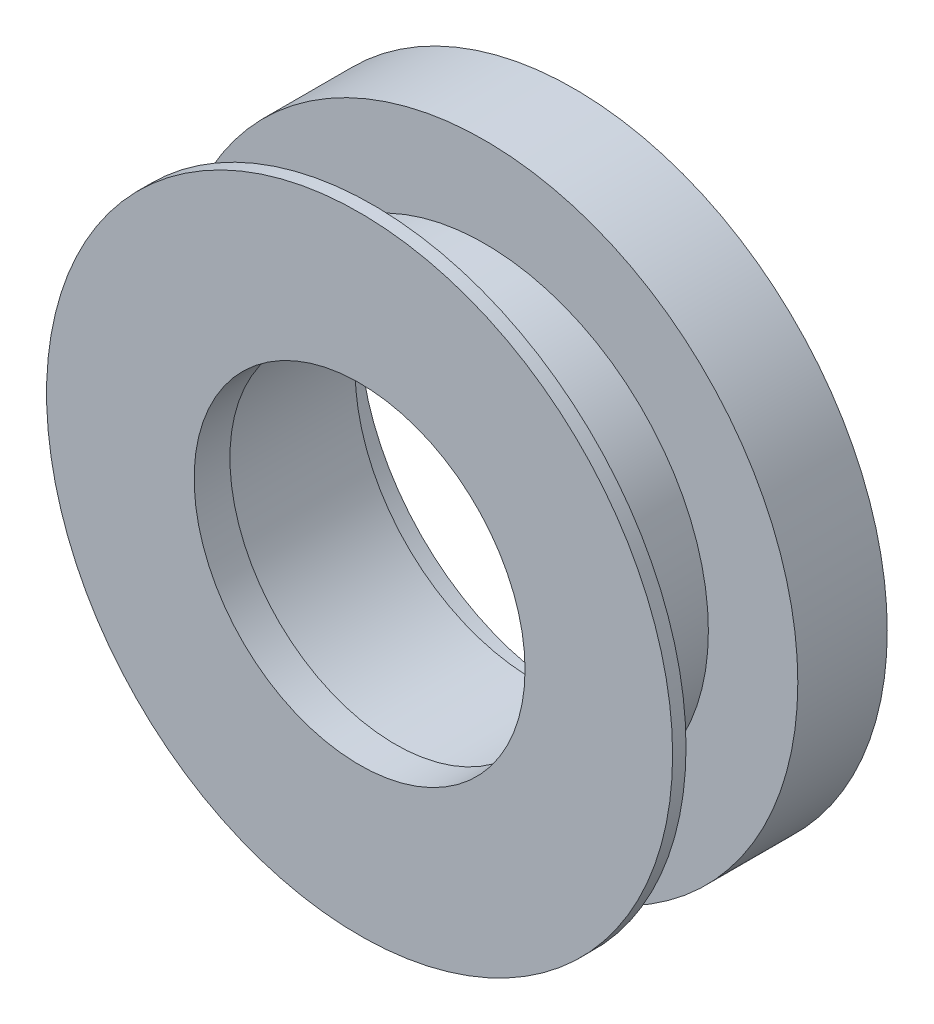
ISO-10303-21;
HEADER;
FILE_DESCRIPTION(('STEP AP214'),'2;1');
FILE_NAME('part.step','',(''),(''),'','','');
FILE_SCHEMA(('AUTOMOTIVE_DESIGN { 1 0 10303 214 1 1 1 1 }'));
ENDSEC;
DATA;
#1=APPLICATION_CONTEXT('core data for automotive mechanical design processes');
#2=APPLICATION_PROTOCOL_DEFINITION('international standard','automotive_design',2000,#1);
#3=PRODUCT_CONTEXT('',#1,'mechanical');
#4=PRODUCT('Part','Part','',(#3));
#5=PRODUCT_RELATED_PRODUCT_CATEGORY('part','',(#4));
#6=PRODUCT_DEFINITION_FORMATION('','',#4);
#7=PRODUCT_DEFINITION_CONTEXT('part definition',#1,'design');
#8=PRODUCT_DEFINITION('design','',#6,#7);
#9=PRODUCT_DEFINITION_SHAPE('','',#8);
#10=(LENGTH_UNIT() NAMED_UNIT(*) SI_UNIT(.MILLI.,.METRE.));
#11=(NAMED_UNIT(*) PLANE_ANGLE_UNIT() SI_UNIT($,.RADIAN.));
#12=(NAMED_UNIT(*) SI_UNIT($,.STERADIAN.) SOLID_ANGLE_UNIT());
#13=UNCERTAINTY_MEASURE_WITH_UNIT(LENGTH_MEASURE(1.E-05),#10,'distance_accuracy_value','');
#14=(GEOMETRIC_REPRESENTATION_CONTEXT(3) GLOBAL_UNCERTAINTY_ASSIGNED_CONTEXT((#13)) GLOBAL_UNIT_ASSIGNED_CONTEXT((#10,
#11,#12)) REPRESENTATION_CONTEXT('',''));
#15=CARTESIAN_POINT('',(0.,0.,0.));
#16=DIRECTION('',(0.,0.,1.));
#17=DIRECTION('',(1.,0.,0.));
#18=AXIS2_PLACEMENT_3D('',#15,#16,#17);
#19=CARTESIAN_POINT('',(0.,0.,-2.1));
#20=DIRECTION('',(0.,0.,1.));
#21=DIRECTION('',(1.,0.,0.));
#22=AXIS2_PLACEMENT_3D('',#19,#20,#21);
#23=PLANE('',#22);
#24=CARTESIAN_POINT('',(0.,0.,-2.1));
#25=DIRECTION('',(0.,0.,1.));
#26=DIRECTION('',(1.,0.,0.));
#27=AXIS2_PLACEMENT_3D('',#24,#25,#26);
#28=CIRCLE('',#27,4.);
#29=CARTESIAN_POINT('',(4.,0.,-2.1));
#30=VERTEX_POINT('',#29);
#31=EDGE_CURVE('E62',#30,#30,#28,.T.);
#32=ORIENTED_EDGE('',*,*,#31,.T.);
#33=EDGE_LOOP('',(#32));
#34=FACE_BOUND('',#33,.T.);
#35=CARTESIAN_POINT('',(0.,0.,-2.1));
#36=DIRECTION('',(0.,0.,1.));
#37=DIRECTION('',(1.,0.,0.));
#38=AXIS2_PLACEMENT_3D('',#35,#36,#37);
#39=CIRCLE('',#38,4.8);
#40=CARTESIAN_POINT('',(4.8,0.,-2.1));
#41=VERTEX_POINT('',#40);
#42=EDGE_CURVE('E10',#41,#41,#39,.T.);
#43=ORIENTED_EDGE('',*,*,#42,.F.);
#44=EDGE_LOOP('',(#43));
#45=FACE_BOUND('',#44,.T.);
#46=ADVANCED_FACE('F39',(#34,#45),#23,.F.);
#47=CARTESIAN_POINT('',(0.,0.,1.));
#48=DIRECTION('',(0.,0.,-1.));
#49=DIRECTION('',(-1.,0.,0.));
#50=AXIS2_PLACEMENT_3D('',#47,#48,#49);
#51=CYLINDRICAL_SURFACE('',#50,5.);
#52=CARTESIAN_POINT('',(0.,0.,-1.));
#53=DIRECTION('',(0.,0.,1.));
#54=DIRECTION('',(1.,0.,0.));
#55=AXIS2_PLACEMENT_3D('',#52,#53,#54);
#56=CIRCLE('',#55,5.);
#57=CARTESIAN_POINT('',(5.,0.,-1.));
#58=VERTEX_POINT('',#57);
#59=EDGE_CURVE('E43',#58,#58,#56,.T.);
#60=ORIENTED_EDGE('',*,*,#59,.T.);
#61=EDGE_LOOP('',(#60));
#62=FACE_BOUND('',#61,.T.);
#63=CARTESIAN_POINT('',(0.,0.,1.5));
#64=DIRECTION('',(0.,0.,1.));
#65=DIRECTION('',(1.,0.,0.));
#66=AXIS2_PLACEMENT_3D('',#63,#64,#65);
#67=CIRCLE('',#66,5.);
#68=CARTESIAN_POINT('',(5.,0.,1.5));
#69=VERTEX_POINT('',#68);
#70=EDGE_CURVE('E50',#69,#69,#67,.T.);
#71=ORIENTED_EDGE('',*,*,#70,.F.);
#72=EDGE_LOOP('',(#71));
#73=FACE_BOUND('',#72,.T.);
#74=ADVANCED_FACE('F41',(#62,#73),#51,.T.);
#75=CARTESIAN_POINT('',(0.,0.,1.));
#76=DIRECTION('',(0.,0.,-1.));
#77=DIRECTION('',(-1.,0.,0.));
#78=AXIS2_PLACEMENT_3D('',#75,#76,#77);
#79=CYLINDRICAL_SURFACE('',#78,4.);
#80=CARTESIAN_POINT('',(0.,0.,1.));
#81=DIRECTION('',(0.,0.,1.));
#82=DIRECTION('',(1.,0.,0.));
#83=AXIS2_PLACEMENT_3D('',#80,#81,#82);
#84=CIRCLE('',#83,4.);
#85=CARTESIAN_POINT('',(4.,0.,1.));
#86=VERTEX_POINT('',#85);
#87=EDGE_CURVE('E55',#86,#86,#84,.T.);
#88=ORIENTED_EDGE('',*,*,#87,.T.);
#89=EDGE_LOOP('',(#88));
#90=FACE_BOUND('',#89,.T.);
#91=ORIENTED_EDGE('',*,*,#31,.F.);
#92=EDGE_LOOP('',(#91));
#93=FACE_BOUND('',#92,.T.);
#94=ADVANCED_FACE('F82',(#90,#93),#79,.F.);
#95=CARTESIAN_POINT('',(0.,0.,1.));
#96=DIRECTION('',(0.,0.,1.));
#97=DIRECTION('',(1.,0.,0.));
#98=AXIS2_PLACEMENT_3D('',#95,#96,#97);
#99=PLANE('',#98);
#100=CARTESIAN_POINT('',(0.,0.,1.));
#101=DIRECTION('',(0.,0.,1.));
#102=DIRECTION('',(1.,0.,0.));
#103=AXIS2_PLACEMENT_3D('',#100,#101,#102);
#104=CIRCLE('',#103,3.7);
#105=CARTESIAN_POINT('',(3.7,0.,1.));
#106=VERTEX_POINT('',#105);
#107=EDGE_CURVE('E68',#106,#106,#104,.T.);
#108=ORIENTED_EDGE('',*,*,#107,.T.);
#109=EDGE_LOOP('',(#108));
#110=FACE_BOUND('',#109,.T.);
#111=ORIENTED_EDGE('',*,*,#87,.F.);
#112=EDGE_LOOP('',(#111));
#113=FACE_BOUND('',#112,.T.);
#114=ADVANCED_FACE('F81',(#110,#113),#99,.F.);
#115=CARTESIAN_POINT('',(0.,0.,1.8));
#116=DIRECTION('',(0.,0.,1.));
#117=DIRECTION('',(1.,0.,0.));
#118=AXIS2_PLACEMENT_3D('',#115,#116,#117);
#119=PLANE('',#118);
#120=CARTESIAN_POINT('',(0.,0.,1.8));
#121=DIRECTION('',(0.,0.,1.));
#122=DIRECTION('',(1.,0.,0.));
#123=AXIS2_PLACEMENT_3D('',#120,#121,#122);
#124=CIRCLE('',#123,3.7);
#125=CARTESIAN_POINT('',(3.7,0.,1.8));
#126=VERTEX_POINT('',#125);
#127=EDGE_CURVE('E74',#126,#126,#124,.T.);
#128=ORIENTED_EDGE('',*,*,#127,.F.);
#129=EDGE_LOOP('',(#128));
#130=FACE_BOUND('',#129,.T.);
#131=CARTESIAN_POINT('',(0.,0.,1.8));
#132=DIRECTION('',(0.,0.,1.));
#133=DIRECTION('',(1.,0.,0.));
#134=AXIS2_PLACEMENT_3D('',#131,#132,#133);
#135=CIRCLE('',#134,7.);
#136=CARTESIAN_POINT('',(7.,0.,1.8));
#137=VERTEX_POINT('',#136);
#138=EDGE_CURVE('E69',#137,#137,#135,.T.);
#139=ORIENTED_EDGE('',*,*,#138,.T.);
#140=EDGE_LOOP('',(#139));
#141=FACE_BOUND('',#140,.T.);
#142=ADVANCED_FACE('F88',(#130,#141),#119,.T.);
#143=CARTESIAN_POINT('',(0.,0.,1.8));
#144=DIRECTION('',(0.,0.,-1.));
#145=DIRECTION('',(-1.,0.,0.));
#146=AXIS2_PLACEMENT_3D('',#143,#144,#145);
#147=CYLINDRICAL_SURFACE('',#146,3.7);
#148=ORIENTED_EDGE('',*,*,#127,.T.);
#149=EDGE_LOOP('',(#148));
#150=FACE_BOUND('',#149,.T.);
#151=ORIENTED_EDGE('',*,*,#107,.F.);
#152=EDGE_LOOP('',(#151));
#153=FACE_BOUND('',#152,.T.);
#154=ADVANCED_FACE('F91',(#150,#153),#147,.F.);
#155=CARTESIAN_POINT('',(0.,0.,1.5));
#156=DIRECTION('',(0.,0.,1.));
#157=DIRECTION('',(1.,0.,0.));
#158=AXIS2_PLACEMENT_3D('',#155,#156,#157);
#159=PLANE('',#158);
#160=CARTESIAN_POINT('',(0.,0.,1.5));
#161=DIRECTION('',(0.,0.,1.));
#162=DIRECTION('',(1.,0.,0.));
#163=AXIS2_PLACEMENT_3D('',#160,#161,#162);
#164=CIRCLE('',#163,7.);
#165=CARTESIAN_POINT('',(7.,0.,1.5));
#166=VERTEX_POINT('',#165);
#167=EDGE_CURVE('E72',#166,#166,#164,.T.);
#168=ORIENTED_EDGE('',*,*,#167,.F.);
#169=EDGE_LOOP('',(#168));
#170=FACE_BOUND('',#169,.T.);
#171=ORIENTED_EDGE('',*,*,#70,.T.);
#172=EDGE_LOOP('',(#171));
#173=FACE_BOUND('',#172,.T.);
#174=ADVANCED_FACE('F111',(#170,#173),#159,.F.);
#175=CARTESIAN_POINT('',(0.,0.,1.8));
#176=DIRECTION('',(0.,0.,-1.));
#177=DIRECTION('',(-1.,0.,0.));
#178=AXIS2_PLACEMENT_3D('',#175,#176,#177);
#179=CYLINDRICAL_SURFACE('',#178,7.);
#180=ORIENTED_EDGE('',*,*,#138,.F.);
#181=EDGE_LOOP('',(#180));
#182=FACE_BOUND('',#181,.T.);
#183=ORIENTED_EDGE('',*,*,#167,.T.);
#184=EDGE_LOOP('',(#183));
#185=FACE_BOUND('',#184,.T.);
#186=ADVANCED_FACE('F120',(#182,#185),#179,.T.);
#187=CARTESIAN_POINT('',(0.,0.,-1.));
#188=DIRECTION('',(0.,0.,1.));
#189=DIRECTION('',(1.,0.,0.));
#190=AXIS2_PLACEMENT_3D('',#187,#188,#189);
#191=PLANE('',#190);
#192=ORIENTED_EDGE('',*,*,#59,.F.);
#193=EDGE_LOOP('',(#192));
#194=FACE_BOUND('',#193,.T.);
#195=CARTESIAN_POINT('',(0.,0.,-1.));
#196=DIRECTION('',(0.,0.,1.));
#197=DIRECTION('',(1.,0.,0.));
#198=AXIS2_PLACEMENT_3D('',#195,#196,#197);
#199=CIRCLE('',#198,7.);
#200=CARTESIAN_POINT('',(7.,0.,-1.));
#201=VERTEX_POINT('',#200);
#202=EDGE_CURVE('E61',#201,#201,#199,.T.);
#203=ORIENTED_EDGE('',*,*,#202,.T.);
#204=EDGE_LOOP('',(#203));
#205=FACE_BOUND('',#204,.T.);
#206=ADVANCED_FACE('F107',(#194,#205),#191,.T.);
#207=CARTESIAN_POINT('',(0.,0.,-1.));
#208=DIRECTION('',(0.,0.,-1.));
#209=DIRECTION('',(-1.,0.,0.));
#210=AXIS2_PLACEMENT_3D('',#207,#208,#209);
#211=CYLINDRICAL_SURFACE('',#210,7.);
#212=ORIENTED_EDGE('',*,*,#202,.F.);
#213=EDGE_LOOP('',(#212));
#214=FACE_BOUND('',#213,.T.);
#215=CARTESIAN_POINT('',(0.,0.,-3.));
#216=DIRECTION('',(0.,0.,1.));
#217=DIRECTION('',(1.,0.,0.));
#218=AXIS2_PLACEMENT_3D('',#215,#216,#217);
#219=CIRCLE('',#218,7.);
#220=CARTESIAN_POINT('',(7.,0.,-3.));
#221=VERTEX_POINT('',#220);
#222=EDGE_CURVE('E59',#221,#221,#219,.T.);
#223=ORIENTED_EDGE('',*,*,#222,.T.);
#224=EDGE_LOOP('',(#223));
#225=FACE_BOUND('',#224,.T.);
#226=ADVANCED_FACE('F109',(#214,#225),#211,.T.);
#227=CARTESIAN_POINT('',(0.,0.,-3.));
#228=DIRECTION('',(0.,0.,1.));
#229=DIRECTION('',(1.,0.,0.));
#230=AXIS2_PLACEMENT_3D('',#227,#228,#229);
#231=PLANE('',#230);
#232=ORIENTED_EDGE('',*,*,#222,.F.);
#233=EDGE_LOOP('',(#232));
#234=FACE_BOUND('',#233,.T.);
#235=CARTESIAN_POINT('',(0.,0.,-3.));
#236=DIRECTION('',(0.,0.,1.));
#237=DIRECTION('',(1.,0.,0.));
#238=AXIS2_PLACEMENT_3D('',#235,#236,#237);
#239=CIRCLE('',#238,4.8);
#240=CARTESIAN_POINT('',(4.8,0.,-3.));
#241=VERTEX_POINT('',#240);
#242=EDGE_CURVE('E54',#241,#241,#239,.T.);
#243=ORIENTED_EDGE('',*,*,#242,.T.);
#244=EDGE_LOOP('',(#243));
#245=FACE_BOUND('',#244,.T.);
#246=ADVANCED_FACE('F115',(#234,#245),#231,.F.);
#247=CARTESIAN_POINT('',(0.,0.,-2.1));
#248=DIRECTION('',(0.,0.,-1.));
#249=DIRECTION('',(-1.,0.,0.));
#250=AXIS2_PLACEMENT_3D('',#247,#248,#249);
#251=CYLINDRICAL_SURFACE('',#250,4.8);
#252=ORIENTED_EDGE('',*,*,#42,.T.);
#253=EDGE_LOOP('',(#252));
#254=FACE_BOUND('',#253,.T.);
#255=ORIENTED_EDGE('',*,*,#242,.F.);
#256=EDGE_LOOP('',(#255));
#257=FACE_BOUND('',#256,.T.);
#258=ADVANCED_FACE('F185',(#254,#257),#251,.F.);
#259=CLOSED_SHELL('',(#46,#74,#94,#114,#142,#154,#174,#186,#206,#226,#246,#258));
#260=MANIFOLD_SOLID_BREP('B2',#259);
#261=ADVANCED_BREP_SHAPE_REPRESENTATION('',(#18,#260),#14);
#262=SHAPE_DEFINITION_REPRESENTATION(#9,#261);
ENDSEC;
END-ISO-10303-21;
